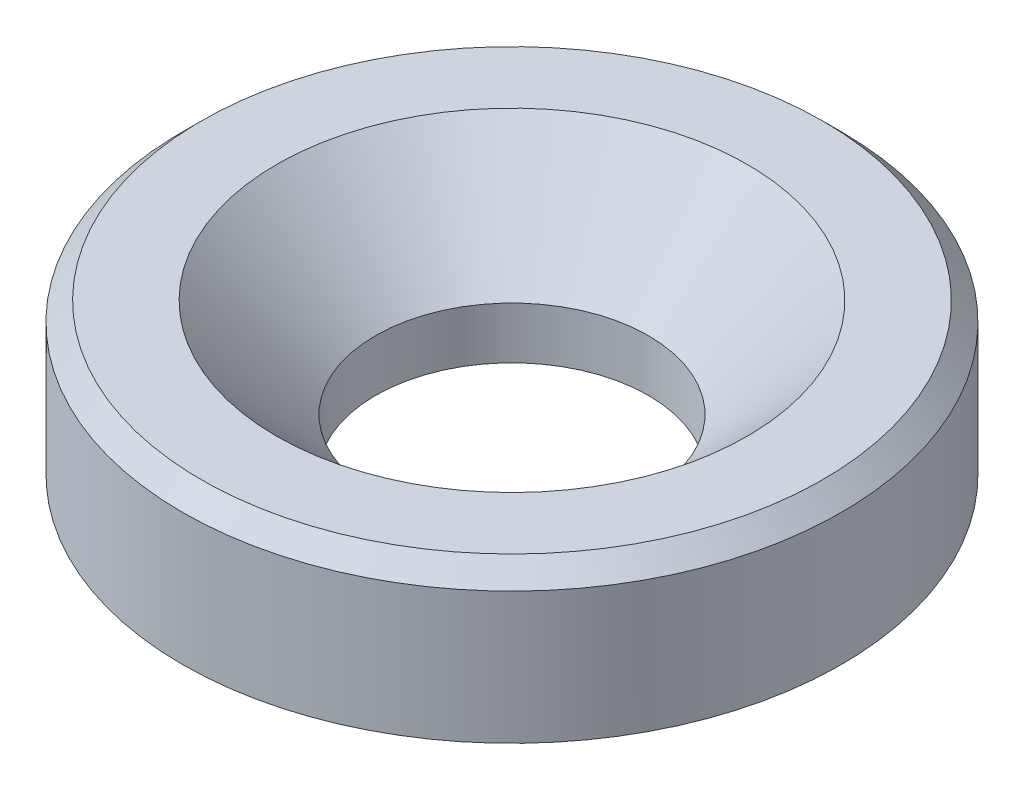
ISO-10303-21;
HEADER;
FILE_DESCRIPTION(('STEP AP214'),'2;1');
FILE_NAME('part.step','',(''),(''),'','','');
FILE_SCHEMA(('AUTOMOTIVE_DESIGN { 1 0 10303 214 1 1 1 1 }'));
ENDSEC;
DATA;
#1=APPLICATION_CONTEXT('core data for automotive mechanical design processes');
#2=APPLICATION_PROTOCOL_DEFINITION('international standard','automotive_design',2000,#1);
#3=PRODUCT_CONTEXT('',#1,'mechanical');
#4=PRODUCT('Part','Part','',(#3));
#5=PRODUCT_RELATED_PRODUCT_CATEGORY('part','',(#4));
#6=PRODUCT_DEFINITION_FORMATION('','',#4);
#7=PRODUCT_DEFINITION_CONTEXT('part definition',#1,'design');
#8=PRODUCT_DEFINITION('design','',#6,#7);
#9=PRODUCT_DEFINITION_SHAPE('','',#8);
#10=(LENGTH_UNIT() NAMED_UNIT(*) SI_UNIT(.MILLI.,.METRE.));
#11=(NAMED_UNIT(*) PLANE_ANGLE_UNIT() SI_UNIT($,.RADIAN.));
#12=(NAMED_UNIT(*) SI_UNIT($,.STERADIAN.) SOLID_ANGLE_UNIT());
#13=UNCERTAINTY_MEASURE_WITH_UNIT(LENGTH_MEASURE(1.E-05),#10,'distance_accuracy_value','');
#14=(GEOMETRIC_REPRESENTATION_CONTEXT(3) GLOBAL_UNCERTAINTY_ASSIGNED_CONTEXT((#13)) GLOBAL_UNIT_ASSIGNED_CONTEXT((#10,
#11,#12)) REPRESENTATION_CONTEXT('',''));
#15=CARTESIAN_POINT('',(0.,0.,0.));
#16=DIRECTION('',(0.,0.,1.));
#17=DIRECTION('',(1.,0.,0.));
#18=AXIS2_PLACEMENT_3D('',#15,#16,#17);
#19=CARTESIAN_POINT('',(0.,11.4523242607018,0.));
#20=DIRECTION('',(0.,1.,0.));
#21=DIRECTION('',(0.,0.,1.));
#22=AXIS2_PLACEMENT_3D('',#19,#20,#21);
#23=CYLINDRICAL_SURFACE('',#22,7.25);
#24=CARTESIAN_POINT('',(0.,0.,0.));
#25=DIRECTION('',(0.,1.,0.));
#26=DIRECTION('',(0.,0.,1.));
#27=AXIS2_PLACEMENT_3D('',#24,#25,#26);
#28=CIRCLE('',#27,7.25);
#29=CARTESIAN_POINT('',(0.,0.,7.25));
#30=VERTEX_POINT('',#29);
#31=EDGE_CURVE('E55',#30,#30,#28,.T.);
#32=ORIENTED_EDGE('',*,*,#31,.F.);
#33=EDGE_LOOP('',(#32));
#34=FACE_BOUND('',#33,.T.);
#35=CARTESIAN_POINT('',(0.,2.75000000000002,0.));
#36=DIRECTION('',(0.,1.,0.));
#37=DIRECTION('',(0.,0.,1.));
#38=AXIS2_PLACEMENT_3D('',#35,#36,#37);
#39=CIRCLE('',#38,7.25);
#40=CARTESIAN_POINT('',(0.,2.75000000000002,7.25));
#41=VERTEX_POINT('',#40);
#42=EDGE_CURVE('E70',#41,#41,#39,.T.);
#43=ORIENTED_EDGE('',*,*,#42,.T.);
#44=EDGE_LOOP('',(#43));
#45=FACE_BOUND('',#44,.T.);
#46=ADVANCED_FACE('F41',(#34,#45),#23,.F.);
#47=CARTESIAN_POINT('',(7.25,0.,0.));
#48=DIRECTION('',(0.,1.,0.));
#49=DIRECTION('',(0.,0.,1.));
#50=AXIS2_PLACEMENT_3D('',#47,#48,#49);
#51=PLANE('',#50);
#52=CARTESIAN_POINT('',(0.,0.,0.));
#53=DIRECTION('',(0.,1.,0.));
#54=DIRECTION('',(0.,0.,1.));
#55=AXIS2_PLACEMENT_3D('',#52,#53,#54);
#56=CIRCLE('',#55,17.5);
#57=CARTESIAN_POINT('',(0.,0.,17.5));
#58=VERTEX_POINT('',#57);
#59=EDGE_CURVE('E60',#58,#58,#56,.T.);
#60=ORIENTED_EDGE('',*,*,#59,.F.);
#61=EDGE_LOOP('',(#60));
#62=FACE_BOUND('',#61,.T.);
#63=ORIENTED_EDGE('',*,*,#31,.T.);
#64=EDGE_LOOP('',(#63));
#65=FACE_BOUND('',#64,.T.);
#66=ADVANCED_FACE('F89',(#62,#65),#51,.F.);
#67=CARTESIAN_POINT('',(0.,11.4523242607018,0.));
#68=DIRECTION('',(0.,1.,0.));
#69=DIRECTION('',(0.,0.,1.));
#70=AXIS2_PLACEMENT_3D('',#67,#68,#69);
#71=CYLINDRICAL_SURFACE('',#70,17.5);
#72=CARTESIAN_POINT('',(0.,6.99999999999999,0.));
#73=DIRECTION('',(0.,-1.,0.));
#74=DIRECTION('',(0.,0.,-1.));
#75=AXIS2_PLACEMENT_3D('',#72,#73,#74);
#76=CIRCLE('',#75,17.5);
#77=CARTESIAN_POINT('',(0.,6.99999999999999,-17.5));
#78=VERTEX_POINT('',#77);
#79=EDGE_CURVE('E10',#78,#78,#76,.T.);
#80=ORIENTED_EDGE('',*,*,#79,.T.);
#81=EDGE_LOOP('',(#80));
#82=FACE_BOUND('',#81,.T.);
#83=ORIENTED_EDGE('',*,*,#59,.T.);
#84=EDGE_LOOP('',(#83));
#85=FACE_BOUND('',#84,.T.);
#86=ADVANCED_FACE('F84',(#82,#85),#71,.T.);
#87=CARTESIAN_POINT('',(17.5,8.,0.));
#88=DIRECTION('',(0.,-1.,0.));
#89=DIRECTION('',(0.,0.,-1.));
#90=AXIS2_PLACEMENT_3D('',#87,#88,#89);
#91=PLANE('',#90);
#92=CARTESIAN_POINT('',(0.,8.,0.));
#93=DIRECTION('',(0.,-1.,0.));
#94=DIRECTION('',(0.,0.,-1.));
#95=AXIS2_PLACEMENT_3D('',#92,#93,#94);
#96=CIRCLE('',#95,16.5);
#97=CARTESIAN_POINT('',(0.,8.,-16.5));
#98=VERTEX_POINT('',#97);
#99=EDGE_CURVE('E50',#98,#98,#96,.F.);
#100=ORIENTED_EDGE('',*,*,#99,.T.);
#101=EDGE_LOOP('',(#100));
#102=FACE_BOUND('',#101,.T.);
#103=CARTESIAN_POINT('',(0.,8.,0.));
#104=DIRECTION('',(0.,1.,0.));
#105=DIRECTION('',(0.,0.,1.));
#106=AXIS2_PLACEMENT_3D('',#103,#104,#105);
#107=CIRCLE('',#106,12.5);
#108=CARTESIAN_POINT('',(0.,8.,12.5));
#109=VERTEX_POINT('',#108);
#110=EDGE_CURVE('E66',#109,#109,#107,.T.);
#111=ORIENTED_EDGE('',*,*,#110,.F.);
#112=EDGE_LOOP('',(#111));
#113=FACE_BOUND('',#112,.T.);
#114=ADVANCED_FACE('F79',(#102,#113),#91,.F.);
#115=CARTESIAN_POINT('',(0.,8.,0.));
#116=DIRECTION('',(0.,1.,0.));
#117=DIRECTION('',(0.,0.,1.));
#118=AXIS2_PLACEMENT_3D('',#115,#116,#117);
#119=CONICAL_SURFACE('',#118,12.5,0.78539816339745);
#120=ORIENTED_EDGE('',*,*,#42,.F.);
#121=EDGE_LOOP('',(#120));
#122=FACE_BOUND('',#121,.T.);
#123=ORIENTED_EDGE('',*,*,#110,.T.);
#124=EDGE_LOOP('',(#123));
#125=FACE_BOUND('',#124,.T.);
#126=ADVANCED_FACE('F76',(#122,#125),#119,.F.);
#127=CARTESIAN_POINT('',(0.,8.,0.));
#128=DIRECTION('',(0.,-1.,0.));
#129=DIRECTION('',(0.,0.,-1.));
#130=AXIS2_PLACEMENT_3D('',#127,#128,#129);
#131=CONICAL_SURFACE('',#130,16.5,0.785398163397445);
#132=ORIENTED_EDGE('',*,*,#79,.F.);
#133=EDGE_LOOP('',(#132));
#134=FACE_BOUND('',#133,.T.);
#135=ORIENTED_EDGE('',*,*,#99,.F.);
#136=EDGE_LOOP('',(#135));
#137=FACE_BOUND('',#136,.T.);
#138=ADVANCED_FACE('F44',(#134,#137),#131,.T.);
#139=CLOSED_SHELL('',(#46,#66,#86,#114,#126,#138));
#140=MANIFOLD_SOLID_BREP('B2',#139);
#141=ADVANCED_BREP_SHAPE_REPRESENTATION('',(#18,#140),#14);
#142=SHAPE_DEFINITION_REPRESENTATION(#9,#141);
ENDSEC;
END-ISO-10303-21;
